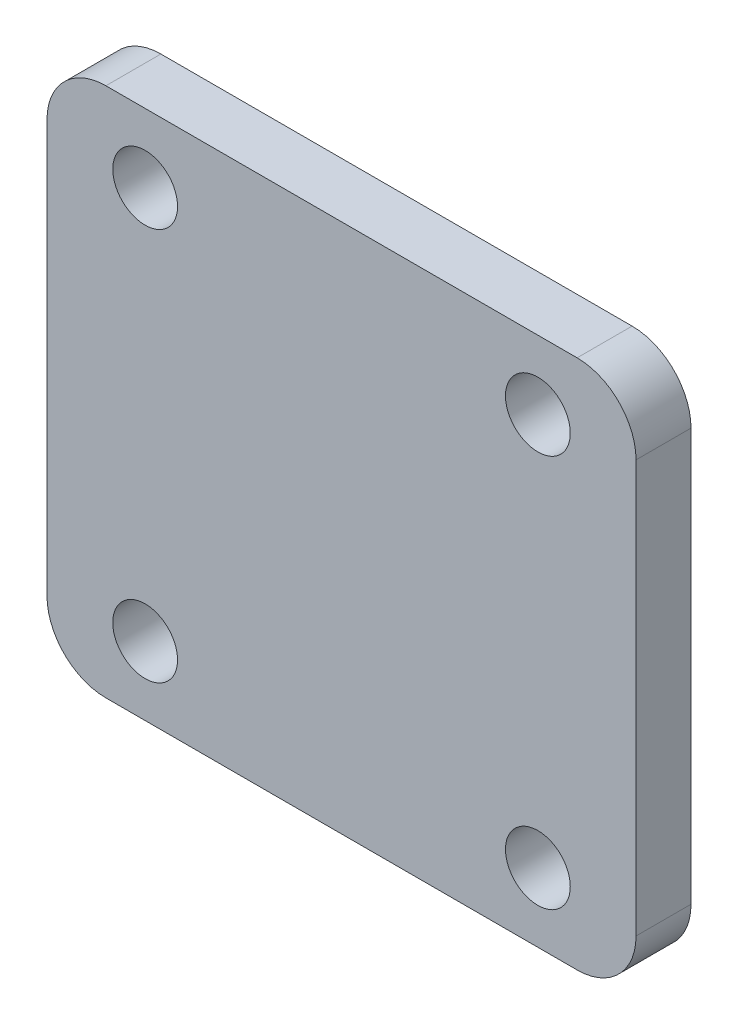
ISO-10303-21;
HEADER;
FILE_DESCRIPTION(('STEP AP214'),'2;1');
FILE_NAME('part.step','',(''),(''),'','','');
FILE_SCHEMA(('AUTOMOTIVE_DESIGN { 1 0 10303 214 1 1 1 1 }'));
ENDSEC;
DATA;
#1=APPLICATION_CONTEXT('core data for automotive mechanical design processes');
#2=APPLICATION_PROTOCOL_DEFINITION('international standard','automotive_design',2000,#1);
#3=PRODUCT_CONTEXT('',#1,'mechanical');
#4=PRODUCT('Part','Part','',(#3));
#5=PRODUCT_RELATED_PRODUCT_CATEGORY('part','',(#4));
#6=PRODUCT_DEFINITION_FORMATION('','',#4);
#7=PRODUCT_DEFINITION_CONTEXT('part definition',#1,'design');
#8=PRODUCT_DEFINITION('design','',#6,#7);
#9=PRODUCT_DEFINITION_SHAPE('','',#8);
#10=(LENGTH_UNIT() NAMED_UNIT(*) SI_UNIT(.MILLI.,.METRE.));
#11=(NAMED_UNIT(*) PLANE_ANGLE_UNIT() SI_UNIT($,.RADIAN.));
#12=(NAMED_UNIT(*) SI_UNIT($,.STERADIAN.) SOLID_ANGLE_UNIT());
#13=UNCERTAINTY_MEASURE_WITH_UNIT(LENGTH_MEASURE(1.E-05),#10,'distance_accuracy_value','');
#14=(GEOMETRIC_REPRESENTATION_CONTEXT(3) GLOBAL_UNCERTAINTY_ASSIGNED_CONTEXT((#13)) GLOBAL_UNIT_ASSIGNED_CONTEXT((#10,
#11,#12)) REPRESENTATION_CONTEXT('',''));
#15=CARTESIAN_POINT('',(0.,0.,0.));
#16=DIRECTION('',(0.,0.,1.));
#17=DIRECTION('',(1.,0.,0.));
#18=AXIS2_PLACEMENT_3D('',#15,#16,#17);
#19=CARTESIAN_POINT('',(0.,0.,2.8));
#20=DIRECTION('',(0.,0.,-1.));
#21=DIRECTION('',(-1.,0.,0.));
#22=AXIS2_PLACEMENT_3D('',#19,#20,#21);
#23=PLANE('',#22);
#24=DIRECTION('',(-1.,0.,0.));
#25=VECTOR('',#24,1.);
#26=CARTESIAN_POINT('',(0.,27.,2.8));
#27=LINE('',#26,#25);
#28=CARTESIAN_POINT('',(27.,27.,2.8));
#29=VERTEX_POINT('',#28);
#30=CARTESIAN_POINT('',(3.,27.,2.8));
#31=VERTEX_POINT('',#30);
#32=EDGE_CURVE('E145',#29,#31,#27,.T.);
#33=ORIENTED_EDGE('',*,*,#32,.T.);
#34=CARTESIAN_POINT('',(3.,24.,2.8));
#35=DIRECTION('',(0.,0.,-1.));
#36=DIRECTION('',(-1.,0.,0.));
#37=AXIS2_PLACEMENT_3D('',#34,#35,#36);
#38=CIRCLE('',#37,3.);
#39=CARTESIAN_POINT('',(0.,24.,2.8));
#40=VERTEX_POINT('',#39);
#41=EDGE_CURVE('E163',#31,#40,#38,.F.);
#42=ORIENTED_EDGE('',*,*,#41,.T.);
#43=DIRECTION('',(0.,-1.,0.));
#44=VECTOR('',#43,1.);
#45=CARTESIAN_POINT('',(0.,0.,2.8));
#46=LINE('',#45,#44);
#47=CARTESIAN_POINT('',(0.,3.,2.8));
#48=VERTEX_POINT('',#47);
#49=EDGE_CURVE('E127',#40,#48,#46,.T.);
#50=ORIENTED_EDGE('',*,*,#49,.T.);
#51=CARTESIAN_POINT('',(3.,3.,2.8));
#52=DIRECTION('',(0.,0.,-1.));
#53=DIRECTION('',(-1.,0.,0.));
#54=AXIS2_PLACEMENT_3D('',#51,#52,#53);
#55=CIRCLE('',#54,3.);
#56=CARTESIAN_POINT('',(3.,0.,2.8));
#57=VERTEX_POINT('',#56);
#58=EDGE_CURVE('E160',#48,#57,#55,.F.);
#59=ORIENTED_EDGE('',*,*,#58,.T.);
#60=DIRECTION('',(1.,0.,0.));
#61=VECTOR('',#60,1.);
#62=CARTESIAN_POINT('',(0.,0.,2.8));
#63=LINE('',#62,#61);
#64=CARTESIAN_POINT('',(27.,0.,2.8));
#65=VERTEX_POINT('',#64);
#66=EDGE_CURVE('E174',#57,#65,#63,.T.);
#67=ORIENTED_EDGE('',*,*,#66,.T.);
#68=CARTESIAN_POINT('',(27.,3.,2.8));
#69=DIRECTION('',(0.,0.,-1.));
#70=DIRECTION('',(-1.,0.,0.));
#71=AXIS2_PLACEMENT_3D('',#68,#69,#70);
#72=CIRCLE('',#71,3.);
#73=CARTESIAN_POINT('',(30.,3.,2.8));
#74=VERTEX_POINT('',#73);
#75=EDGE_CURVE('E63',#65,#74,#72,.F.);
#76=ORIENTED_EDGE('',*,*,#75,.T.);
#77=DIRECTION('',(0.,1.,0.));
#78=VECTOR('',#77,1.);
#79=CARTESIAN_POINT('',(30.,0.,2.8));
#80=LINE('',#79,#78);
#81=CARTESIAN_POINT('',(30.,24.,2.8));
#82=VERTEX_POINT('',#81);
#83=EDGE_CURVE('E182',#74,#82,#80,.T.);
#84=ORIENTED_EDGE('',*,*,#83,.T.);
#85=CARTESIAN_POINT('',(27.,24.,2.8));
#86=DIRECTION('',(0.,0.,-1.));
#87=DIRECTION('',(-1.,0.,0.));
#88=AXIS2_PLACEMENT_3D('',#85,#86,#87);
#89=CIRCLE('',#88,3.);
#90=EDGE_CURVE('E158',#82,#29,#89,.F.);
#91=ORIENTED_EDGE('',*,*,#90,.T.);
#92=EDGE_LOOP('',(#33,#42,#50,#59,#67,#76,#84,#91));
#93=FACE_BOUND('',#92,.T.);
#94=CARTESIAN_POINT('',(5.,23.5,2.8));
#95=DIRECTION('',(0.,0.,1.));
#96=DIRECTION('',(1.,0.,0.));
#97=AXIS2_PLACEMENT_3D('',#94,#95,#96);
#98=CIRCLE('',#97,1.65);
#99=CARTESIAN_POINT('',(6.65,23.5,2.8));
#100=VERTEX_POINT('',#99);
#101=EDGE_CURVE('E136',#100,#100,#98,.T.);
#102=ORIENTED_EDGE('',*,*,#101,.F.);
#103=EDGE_LOOP('',(#102));
#104=FACE_BOUND('',#103,.T.);
#105=CARTESIAN_POINT('',(25.,23.5,2.8));
#106=DIRECTION('',(0.,0.,1.));
#107=DIRECTION('',(-1.,0.,0.));
#108=AXIS2_PLACEMENT_3D('',#105,#106,#107);
#109=CIRCLE('',#108,1.65);
#110=CARTESIAN_POINT('',(23.35,23.5,2.8));
#111=VERTEX_POINT('',#110);
#112=EDGE_CURVE('E189',#111,#111,#109,.T.);
#113=ORIENTED_EDGE('',*,*,#112,.F.);
#114=EDGE_LOOP('',(#113));
#115=FACE_BOUND('',#114,.T.);
#116=CARTESIAN_POINT('',(25.,3.5,2.8));
#117=DIRECTION('',(0.,0.,1.));
#118=DIRECTION('',(1.,0.,0.));
#119=AXIS2_PLACEMENT_3D('',#116,#117,#118);
#120=CIRCLE('',#119,1.65);
#121=CARTESIAN_POINT('',(26.65,3.5,2.8));
#122=VERTEX_POINT('',#121);
#123=EDGE_CURVE('E194',#122,#122,#120,.T.);
#124=ORIENTED_EDGE('',*,*,#123,.F.);
#125=EDGE_LOOP('',(#124));
#126=FACE_BOUND('',#125,.T.);
#127=CARTESIAN_POINT('',(5.,3.5,2.8));
#128=DIRECTION('',(0.,0.,1.));
#129=DIRECTION('',(-1.,0.,0.));
#130=AXIS2_PLACEMENT_3D('',#127,#128,#129);
#131=CIRCLE('',#130,1.65);
#132=CARTESIAN_POINT('',(3.35,3.5,2.8));
#133=VERTEX_POINT('',#132);
#134=EDGE_CURVE('E200',#133,#133,#131,.T.);
#135=ORIENTED_EDGE('',*,*,#134,.F.);
#136=EDGE_LOOP('',(#135));
#137=FACE_BOUND('',#136,.T.);
#138=ADVANCED_FACE('F41',(#93,#104,#115,#126,#137),#23,.F.);
#139=CARTESIAN_POINT('',(0.,0.,0.));
#140=DIRECTION('',(0.,0.,-1.));
#141=DIRECTION('',(-1.,0.,0.));
#142=AXIS2_PLACEMENT_3D('',#139,#140,#141);
#143=PLANE('',#142);
#144=CARTESIAN_POINT('',(25.,3.5,0.));
#145=DIRECTION('',(0.,0.,1.));
#146=DIRECTION('',(1.,0.,0.));
#147=AXIS2_PLACEMENT_3D('',#144,#145,#146);
#148=CIRCLE('',#147,1.65);
#149=CARTESIAN_POINT('',(26.65,3.5,0.));
#150=VERTEX_POINT('',#149);
#151=EDGE_CURVE('E197',#150,#150,#148,.T.);
#152=ORIENTED_EDGE('',*,*,#151,.T.);
#153=EDGE_LOOP('',(#152));
#154=FACE_BOUND('',#153,.T.);
#155=CARTESIAN_POINT('',(5.,23.5,0.));
#156=DIRECTION('',(0.,0.,1.));
#157=DIRECTION('',(1.,0.,0.));
#158=AXIS2_PLACEMENT_3D('',#155,#156,#157);
#159=CIRCLE('',#158,1.65);
#160=CARTESIAN_POINT('',(6.65,23.5,0.));
#161=VERTEX_POINT('',#160);
#162=EDGE_CURVE('E142',#161,#161,#159,.T.);
#163=ORIENTED_EDGE('',*,*,#162,.T.);
#164=EDGE_LOOP('',(#163));
#165=FACE_BOUND('',#164,.T.);
#166=DIRECTION('',(0.,-1.,0.));
#167=VECTOR('',#166,1.);
#168=CARTESIAN_POINT('',(0.,0.,0.));
#169=LINE('',#168,#167);
#170=CARTESIAN_POINT('',(0.,24.,0.));
#171=VERTEX_POINT('',#170);
#172=CARTESIAN_POINT('',(0.,3.,0.));
#173=VERTEX_POINT('',#172);
#174=EDGE_CURVE('E124',#171,#173,#169,.T.);
#175=ORIENTED_EDGE('',*,*,#174,.F.);
#176=CARTESIAN_POINT('',(3.,24.,0.));
#177=DIRECTION('',(0.,0.,-1.));
#178=DIRECTION('',(-1.,0.,0.));
#179=AXIS2_PLACEMENT_3D('',#176,#177,#178);
#180=CIRCLE('',#179,3.);
#181=CARTESIAN_POINT('',(3.,27.,0.));
#182=VERTEX_POINT('',#181);
#183=EDGE_CURVE('E107',#171,#182,#180,.T.);
#184=ORIENTED_EDGE('',*,*,#183,.T.);
#185=DIRECTION('',(-1.,0.,0.));
#186=VECTOR('',#185,1.);
#187=CARTESIAN_POINT('',(0.,27.,0.));
#188=LINE('',#187,#186);
#189=CARTESIAN_POINT('',(27.,27.,0.));
#190=VERTEX_POINT('',#189);
#191=EDGE_CURVE('E149',#190,#182,#188,.T.);
#192=ORIENTED_EDGE('',*,*,#191,.F.);
#193=CARTESIAN_POINT('',(27.,24.,0.));
#194=DIRECTION('',(0.,0.,-1.));
#195=DIRECTION('',(-1.,0.,0.));
#196=AXIS2_PLACEMENT_3D('',#193,#194,#195);
#197=CIRCLE('',#196,3.);
#198=CARTESIAN_POINT('',(30.,24.,0.));
#199=VERTEX_POINT('',#198);
#200=EDGE_CURVE('E128',#190,#199,#197,.T.);
#201=ORIENTED_EDGE('',*,*,#200,.T.);
#202=DIRECTION('',(0.,1.,0.));
#203=VECTOR('',#202,1.);
#204=CARTESIAN_POINT('',(30.,0.,0.));
#205=LINE('',#204,#203);
#206=CARTESIAN_POINT('',(30.,3.,0.));
#207=VERTEX_POINT('',#206);
#208=EDGE_CURVE('E139',#207,#199,#205,.T.);
#209=ORIENTED_EDGE('',*,*,#208,.F.);
#210=CARTESIAN_POINT('',(27.,3.,0.));
#211=DIRECTION('',(0.,0.,-1.));
#212=DIRECTION('',(-1.,0.,0.));
#213=AXIS2_PLACEMENT_3D('',#210,#211,#212);
#214=CIRCLE('',#213,3.);
#215=CARTESIAN_POINT('',(27.,0.,0.));
#216=VERTEX_POINT('',#215);
#217=EDGE_CURVE('E118',#207,#216,#214,.T.);
#218=ORIENTED_EDGE('',*,*,#217,.T.);
#219=DIRECTION('',(1.,0.,0.));
#220=VECTOR('',#219,1.);
#221=CARTESIAN_POINT('',(0.,0.,0.));
#222=LINE('',#221,#220);
#223=CARTESIAN_POINT('',(3.,0.,0.));
#224=VERTEX_POINT('',#223);
#225=EDGE_CURVE('E135',#224,#216,#222,.T.);
#226=ORIENTED_EDGE('',*,*,#225,.F.);
#227=CARTESIAN_POINT('',(3.,3.,0.));
#228=DIRECTION('',(0.,0.,-1.));
#229=DIRECTION('',(-1.,0.,0.));
#230=AXIS2_PLACEMENT_3D('',#227,#228,#229);
#231=CIRCLE('',#230,3.);
#232=EDGE_CURVE('E134',#224,#173,#231,.T.);
#233=ORIENTED_EDGE('',*,*,#232,.T.);
#234=EDGE_LOOP('',(#175,#184,#192,#201,#209,#218,#226,#233));
#235=FACE_BOUND('',#234,.T.);
#236=CARTESIAN_POINT('',(25.,23.5,0.));
#237=DIRECTION('',(0.,0.,1.));
#238=DIRECTION('',(-1.,0.,0.));
#239=AXIS2_PLACEMENT_3D('',#236,#237,#238);
#240=CIRCLE('',#239,1.65);
#241=CARTESIAN_POINT('',(23.35,23.5,0.));
#242=VERTEX_POINT('',#241);
#243=EDGE_CURVE('E191',#242,#242,#240,.T.);
#244=ORIENTED_EDGE('',*,*,#243,.T.);
#245=EDGE_LOOP('',(#244));
#246=FACE_BOUND('',#245,.T.);
#247=CARTESIAN_POINT('',(5.,3.5,0.));
#248=DIRECTION('',(0.,0.,1.));
#249=DIRECTION('',(-1.,0.,0.));
#250=AXIS2_PLACEMENT_3D('',#247,#248,#249);
#251=CIRCLE('',#250,1.65);
#252=CARTESIAN_POINT('',(3.35,3.5,0.));
#253=VERTEX_POINT('',#252);
#254=EDGE_CURVE('E203',#253,#253,#251,.T.);
#255=ORIENTED_EDGE('',*,*,#254,.T.);
#256=EDGE_LOOP('',(#255));
#257=FACE_BOUND('',#256,.T.);
#258=ADVANCED_FACE('F131',(#154,#165,#235,#246,#257),#143,.T.);
#259=CARTESIAN_POINT('',(0.,0.,2.8));
#260=DIRECTION('',(1.,0.,0.));
#261=DIRECTION('',(0.,1.,0.));
#262=AXIS2_PLACEMENT_3D('',#259,#260,#261);
#263=PLANE('',#262);
#264=ORIENTED_EDGE('',*,*,#49,.F.);
#265=DIRECTION('',(0.,0.,-1.));
#266=VECTOR('',#265,1.);
#267=CARTESIAN_POINT('',(0.,24.,2.8));
#268=LINE('',#267,#266);
#269=EDGE_CURVE('E111',#40,#171,#268,.T.);
#270=ORIENTED_EDGE('',*,*,#269,.T.);
#271=ORIENTED_EDGE('',*,*,#174,.T.);
#272=DIRECTION('',(0.,0.,-1.));
#273=VECTOR('',#272,1.);
#274=CARTESIAN_POINT('',(0.,3.,2.8));
#275=LINE('',#274,#273);
#276=EDGE_CURVE('E129',#173,#48,#275,.F.);
#277=ORIENTED_EDGE('',*,*,#276,.T.);
#278=EDGE_LOOP('',(#264,#270,#271,#277));
#279=FACE_BOUND('',#278,.T.);
#280=ADVANCED_FACE('F123',(#279),#263,.F.);
#281=CARTESIAN_POINT('',(0.,0.,2.8));
#282=DIRECTION('',(0.,1.,0.));
#283=DIRECTION('',(0.,0.,1.));
#284=AXIS2_PLACEMENT_3D('',#281,#282,#283);
#285=PLANE('',#284);
#286=ORIENTED_EDGE('',*,*,#225,.T.);
#287=DIRECTION('',(0.,0.,-1.));
#288=VECTOR('',#287,1.);
#289=CARTESIAN_POINT('',(27.,0.,2.8));
#290=LINE('',#289,#288);
#291=EDGE_CURVE('E11',#216,#65,#290,.F.);
#292=ORIENTED_EDGE('',*,*,#291,.T.);
#293=ORIENTED_EDGE('',*,*,#66,.F.);
#294=DIRECTION('',(0.,0.,-1.));
#295=VECTOR('',#294,1.);
#296=CARTESIAN_POINT('',(3.,0.,2.8));
#297=LINE('',#296,#295);
#298=EDGE_CURVE('E49',#57,#224,#297,.T.);
#299=ORIENTED_EDGE('',*,*,#298,.T.);
#300=EDGE_LOOP('',(#286,#292,#293,#299));
#301=FACE_BOUND('',#300,.T.);
#302=ADVANCED_FACE('F172',(#301),#285,.F.);
#303=CARTESIAN_POINT('',(30.,0.,2.8));
#304=DIRECTION('',(-1.,0.,0.));
#305=DIRECTION('',(0.,0.,1.));
#306=AXIS2_PLACEMENT_3D('',#303,#304,#305);
#307=PLANE('',#306);
#308=ORIENTED_EDGE('',*,*,#83,.F.);
#309=DIRECTION('',(0.,0.,-1.));
#310=VECTOR('',#309,1.);
#311=CARTESIAN_POINT('',(30.,3.,2.8));
#312=LINE('',#311,#310);
#313=EDGE_CURVE('E166',#74,#207,#312,.T.);
#314=ORIENTED_EDGE('',*,*,#313,.T.);
#315=ORIENTED_EDGE('',*,*,#208,.T.);
#316=DIRECTION('',(0.,0.,-1.));
#317=VECTOR('',#316,1.);
#318=CARTESIAN_POINT('',(30.,24.,2.8));
#319=LINE('',#318,#317);
#320=EDGE_CURVE('E56',#199,#82,#319,.F.);
#321=ORIENTED_EDGE('',*,*,#320,.T.);
#322=EDGE_LOOP('',(#308,#314,#315,#321));
#323=FACE_BOUND('',#322,.T.);
#324=ADVANCED_FACE('F181',(#323),#307,.F.);
#325=CARTESIAN_POINT('',(0.,27.,2.8));
#326=DIRECTION('',(0.,-1.,0.));
#327=DIRECTION('',(0.,0.,-1.));
#328=AXIS2_PLACEMENT_3D('',#325,#326,#327);
#329=PLANE('',#328);
#330=ORIENTED_EDGE('',*,*,#191,.T.);
#331=DIRECTION('',(0.,0.,-1.));
#332=VECTOR('',#331,1.);
#333=CARTESIAN_POINT('',(3.,27.,2.8));
#334=LINE('',#333,#332);
#335=EDGE_CURVE('E112',#182,#31,#334,.F.);
#336=ORIENTED_EDGE('',*,*,#335,.T.);
#337=ORIENTED_EDGE('',*,*,#32,.F.);
#338=DIRECTION('',(0.,0.,-1.));
#339=VECTOR('',#338,1.);
#340=CARTESIAN_POINT('',(27.,27.,2.8));
#341=LINE('',#340,#339);
#342=EDGE_CURVE('E117',#29,#190,#341,.T.);
#343=ORIENTED_EDGE('',*,*,#342,.T.);
#344=EDGE_LOOP('',(#330,#336,#337,#343));
#345=FACE_BOUND('',#344,.T.);
#346=ADVANCED_FACE('F225',(#345),#329,.F.);
#347=CARTESIAN_POINT('',(5.,23.5,2.8));
#348=DIRECTION('',(0.,0.,-1.));
#349=DIRECTION('',(-1.,0.,0.));
#350=AXIS2_PLACEMENT_3D('',#347,#348,#349);
#351=CYLINDRICAL_SURFACE('',#350,1.65);
#352=ORIENTED_EDGE('',*,*,#101,.T.);
#353=EDGE_LOOP('',(#352));
#354=FACE_BOUND('',#353,.T.);
#355=ORIENTED_EDGE('',*,*,#162,.F.);
#356=EDGE_LOOP('',(#355));
#357=FACE_BOUND('',#356,.T.);
#358=ADVANCED_FACE('F222',(#354,#357),#351,.F.);
#359=CARTESIAN_POINT('',(25.,23.5,2.8));
#360=DIRECTION('',(0.,0.,-1.));
#361=DIRECTION('',(-1.,0.,0.));
#362=AXIS2_PLACEMENT_3D('',#359,#360,#361);
#363=CYLINDRICAL_SURFACE('',#362,1.65);
#364=ORIENTED_EDGE('',*,*,#112,.T.);
#365=EDGE_LOOP('',(#364));
#366=FACE_BOUND('',#365,.T.);
#367=ORIENTED_EDGE('',*,*,#243,.F.);
#368=EDGE_LOOP('',(#367));
#369=FACE_BOUND('',#368,.T.);
#370=ADVANCED_FACE('F282',(#366,#369),#363,.F.);
#371=CARTESIAN_POINT('',(25.,3.5,2.8));
#372=DIRECTION('',(0.,0.,-1.));
#373=DIRECTION('',(-1.,0.,0.));
#374=AXIS2_PLACEMENT_3D('',#371,#372,#373);
#375=CYLINDRICAL_SURFACE('',#374,1.65);
#376=ORIENTED_EDGE('',*,*,#123,.T.);
#377=EDGE_LOOP('',(#376));
#378=FACE_BOUND('',#377,.T.);
#379=ORIENTED_EDGE('',*,*,#151,.F.);
#380=EDGE_LOOP('',(#379));
#381=FACE_BOUND('',#380,.T.);
#382=ADVANCED_FACE('F273',(#378,#381),#375,.F.);
#383=CARTESIAN_POINT('',(5.,3.5,2.8));
#384=DIRECTION('',(0.,0.,-1.));
#385=DIRECTION('',(-1.,0.,0.));
#386=AXIS2_PLACEMENT_3D('',#383,#384,#385);
#387=CYLINDRICAL_SURFACE('',#386,1.65);
#388=ORIENTED_EDGE('',*,*,#134,.T.);
#389=EDGE_LOOP('',(#388));
#390=FACE_BOUND('',#389,.T.);
#391=ORIENTED_EDGE('',*,*,#254,.F.);
#392=EDGE_LOOP('',(#391));
#393=FACE_BOUND('',#392,.T.);
#394=ADVANCED_FACE('F209',(#390,#393),#387,.F.);
#395=CARTESIAN_POINT('',(3.,24.,2.8));
#396=DIRECTION('',(0.,0.,-1.));
#397=DIRECTION('',(-1.,0.,0.));
#398=AXIS2_PLACEMENT_3D('',#395,#396,#397);
#399=CYLINDRICAL_SURFACE('',#398,3.);
#400=ORIENTED_EDGE('',*,*,#41,.F.);
#401=ORIENTED_EDGE('',*,*,#335,.F.);
#402=ORIENTED_EDGE('',*,*,#183,.F.);
#403=ORIENTED_EDGE('',*,*,#269,.F.);
#404=EDGE_LOOP('',(#400,#401,#402,#403));
#405=FACE_BOUND('',#404,.T.);
#406=ADVANCED_FACE('F110',(#405),#399,.T.);
#407=CARTESIAN_POINT('',(27.,3.,2.8));
#408=DIRECTION('',(0.,0.,-1.));
#409=DIRECTION('',(-1.,0.,0.));
#410=AXIS2_PLACEMENT_3D('',#407,#408,#409);
#411=CYLINDRICAL_SURFACE('',#410,3.);
#412=ORIENTED_EDGE('',*,*,#75,.F.);
#413=ORIENTED_EDGE('',*,*,#291,.F.);
#414=ORIENTED_EDGE('',*,*,#217,.F.);
#415=ORIENTED_EDGE('',*,*,#313,.F.);
#416=EDGE_LOOP('',(#412,#413,#414,#415));
#417=FACE_BOUND('',#416,.T.);
#418=ADVANCED_FACE('F180',(#417),#411,.T.);
#419=CARTESIAN_POINT('',(3.,3.,2.8));
#420=DIRECTION('',(0.,0.,-1.));
#421=DIRECTION('',(-1.,0.,0.));
#422=AXIS2_PLACEMENT_3D('',#419,#420,#421);
#423=CYLINDRICAL_SURFACE('',#422,3.);
#424=ORIENTED_EDGE('',*,*,#58,.F.);
#425=ORIENTED_EDGE('',*,*,#276,.F.);
#426=ORIENTED_EDGE('',*,*,#232,.F.);
#427=ORIENTED_EDGE('',*,*,#298,.F.);
#428=EDGE_LOOP('',(#424,#425,#426,#427));
#429=FACE_BOUND('',#428,.T.);
#430=ADVANCED_FACE('F238',(#429),#423,.T.);
#431=CARTESIAN_POINT('',(27.,24.,2.8));
#432=DIRECTION('',(0.,0.,-1.));
#433=DIRECTION('',(-1.,0.,0.));
#434=AXIS2_PLACEMENT_3D('',#431,#432,#433);
#435=CYLINDRICAL_SURFACE('',#434,3.);
#436=ORIENTED_EDGE('',*,*,#90,.F.);
#437=ORIENTED_EDGE('',*,*,#320,.F.);
#438=ORIENTED_EDGE('',*,*,#200,.F.);
#439=ORIENTED_EDGE('',*,*,#342,.F.);
#440=EDGE_LOOP('',(#436,#437,#438,#439));
#441=FACE_BOUND('',#440,.T.);
#442=ADVANCED_FACE('F43',(#441),#435,.T.);
#443=CLOSED_SHELL('',(#138,#258,#280,#302,#324,#346,#358,#370,#382,#394,#406,#418,#430,#442));
#444=MANIFOLD_SOLID_BREP('B2',#443);
#445=ADVANCED_BREP_SHAPE_REPRESENTATION('',(#18,#444),#14);
#446=SHAPE_DEFINITION_REPRESENTATION(#9,#445);
ENDSEC;
END-ISO-10303-21;
